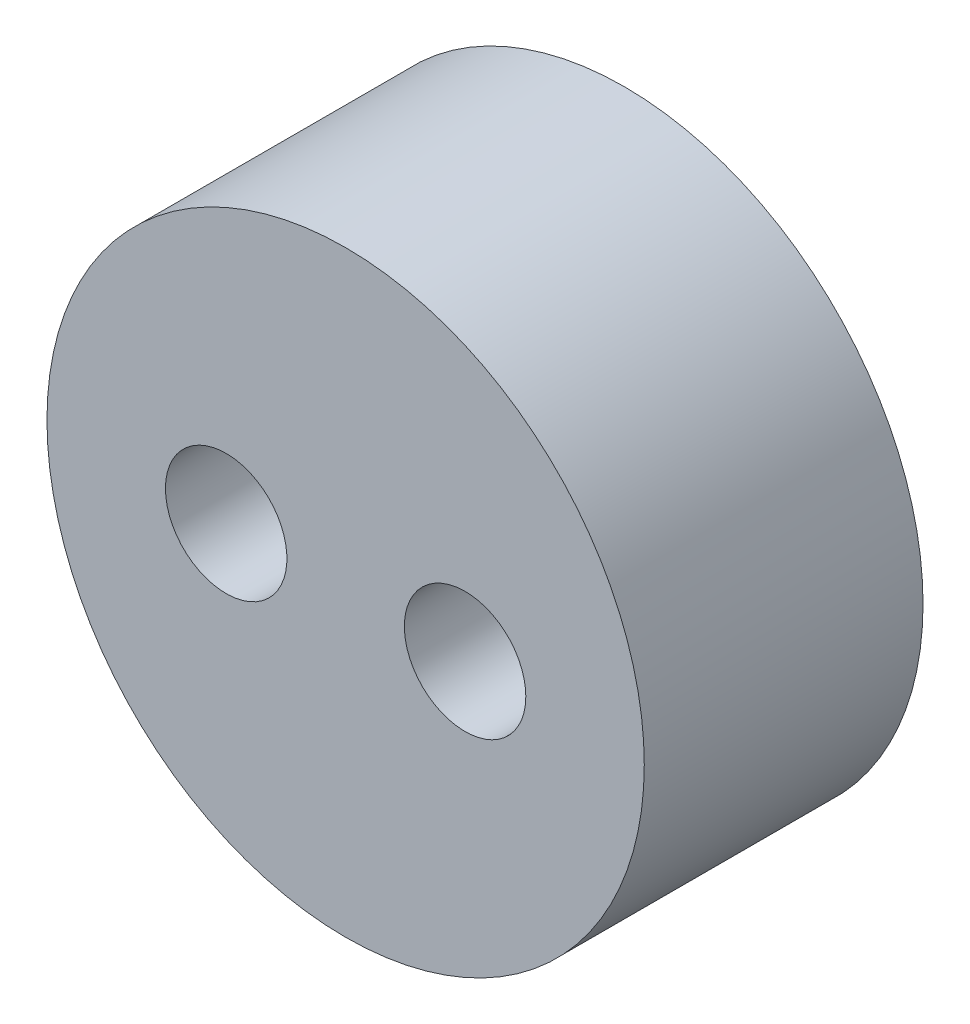
ISO-10303-21;
HEADER;
FILE_DESCRIPTION(('STEP AP214'),'2;1');
FILE_NAME('part.step','',(''),(''),'','','');
FILE_SCHEMA(('AUTOMOTIVE_DESIGN { 1 0 10303 214 1 1 1 1 }'));
ENDSEC;
DATA;
#1=APPLICATION_CONTEXT('core data for automotive mechanical design processes');
#2=APPLICATION_PROTOCOL_DEFINITION('international standard','automotive_design',2000,#1);
#3=PRODUCT_CONTEXT('',#1,'mechanical');
#4=PRODUCT('Part','Part','',(#3));
#5=PRODUCT_RELATED_PRODUCT_CATEGORY('part','',(#4));
#6=PRODUCT_DEFINITION_FORMATION('','',#4);
#7=PRODUCT_DEFINITION_CONTEXT('part definition',#1,'design');
#8=PRODUCT_DEFINITION('design','',#6,#7);
#9=PRODUCT_DEFINITION_SHAPE('','',#8);
#10=(LENGTH_UNIT() NAMED_UNIT(*) SI_UNIT(.MILLI.,.METRE.));
#11=(NAMED_UNIT(*) PLANE_ANGLE_UNIT() SI_UNIT($,.RADIAN.));
#12=(NAMED_UNIT(*) SI_UNIT($,.STERADIAN.) SOLID_ANGLE_UNIT());
#13=UNCERTAINTY_MEASURE_WITH_UNIT(LENGTH_MEASURE(1.E-05),#10,'distance_accuracy_value','');
#14=(GEOMETRIC_REPRESENTATION_CONTEXT(3) GLOBAL_UNCERTAINTY_ASSIGNED_CONTEXT((#13)) GLOBAL_UNIT_ASSIGNED_CONTEXT((#10,
#11,#12)) REPRESENTATION_CONTEXT('',''));
#15=CARTESIAN_POINT('',(0.,0.,0.));
#16=DIRECTION('',(0.,0.,1.));
#17=DIRECTION('',(1.,0.,0.));
#18=AXIS2_PLACEMENT_3D('',#15,#16,#17);
#19=CARTESIAN_POINT('',(0.,0.,7.));
#20=DIRECTION('',(0.,0.,1.));
#21=DIRECTION('',(1.,0.,0.));
#22=AXIS2_PLACEMENT_3D('',#19,#20,#21);
#23=PLANE('',#22);
#24=CARTESIAN_POINT('',(0.,0.,7.));
#25=DIRECTION('',(0.,0.,1.));
#26=DIRECTION('',(1.,0.,0.));
#27=AXIS2_PLACEMENT_3D('',#24,#25,#26);
#28=CIRCLE('',#27,7.5);
#29=CARTESIAN_POINT('',(7.5,0.,7.));
#30=VERTEX_POINT('',#29);
#31=EDGE_CURVE('E10',#30,#30,#28,.T.);
#32=ORIENTED_EDGE('',*,*,#31,.T.);
#33=EDGE_LOOP('',(#32));
#34=FACE_BOUND('',#33,.T.);
#35=CARTESIAN_POINT('',(3.,0.,7.));
#36=DIRECTION('',(0.,0.,1.));
#37=DIRECTION('',(1.,0.,0.));
#38=AXIS2_PLACEMENT_3D('',#35,#36,#37);
#39=CIRCLE('',#38,1.525);
#40=CARTESIAN_POINT('',(4.525,0.,7.));
#41=VERTEX_POINT('',#40);
#42=EDGE_CURVE('E52',#41,#41,#39,.T.);
#43=ORIENTED_EDGE('',*,*,#42,.F.);
#44=EDGE_LOOP('',(#43));
#45=FACE_BOUND('',#44,.T.);
#46=CARTESIAN_POINT('',(-3.,0.,7.));
#47=DIRECTION('',(0.,0.,-1.));
#48=DIRECTION('',(-1.,0.,0.));
#49=AXIS2_PLACEMENT_3D('',#46,#47,#48);
#50=CIRCLE('',#49,1.525);
#51=CARTESIAN_POINT('',(-4.525,0.,7.));
#52=VERTEX_POINT('',#51);
#53=EDGE_CURVE('E55',#52,#52,#50,.T.);
#54=ORIENTED_EDGE('',*,*,#53,.T.);
#55=EDGE_LOOP('',(#54));
#56=FACE_BOUND('',#55,.T.);
#57=ADVANCED_FACE('F36',(#34,#45,#56),#23,.T.);
#58=CARTESIAN_POINT('',(0.,0.,0.));
#59=DIRECTION('',(0.,0.,1.));
#60=DIRECTION('',(1.,0.,0.));
#61=AXIS2_PLACEMENT_3D('',#58,#59,#60);
#62=PLANE('',#61);
#63=CARTESIAN_POINT('',(3.,0.,0.));
#64=DIRECTION('',(0.,0.,1.));
#65=DIRECTION('',(1.,0.,0.));
#66=AXIS2_PLACEMENT_3D('',#63,#64,#65);
#67=CIRCLE('',#66,1.525);
#68=CARTESIAN_POINT('',(4.525,0.,0.));
#69=VERTEX_POINT('',#68);
#70=EDGE_CURVE('E49',#69,#69,#67,.T.);
#71=ORIENTED_EDGE('',*,*,#70,.T.);
#72=EDGE_LOOP('',(#71));
#73=FACE_BOUND('',#72,.T.);
#74=CARTESIAN_POINT('',(0.,0.,0.));
#75=DIRECTION('',(0.,0.,1.));
#76=DIRECTION('',(1.,0.,0.));
#77=AXIS2_PLACEMENT_3D('',#74,#75,#76);
#78=CIRCLE('',#77,7.5);
#79=CARTESIAN_POINT('',(7.5,0.,0.));
#80=VERTEX_POINT('',#79);
#81=EDGE_CURVE('E40',#80,#80,#78,.T.);
#82=ORIENTED_EDGE('',*,*,#81,.F.);
#83=EDGE_LOOP('',(#82));
#84=FACE_BOUND('',#83,.T.);
#85=CARTESIAN_POINT('',(-3.,0.,0.));
#86=DIRECTION('',(0.,0.,-1.));
#87=DIRECTION('',(-1.,0.,0.));
#88=AXIS2_PLACEMENT_3D('',#85,#86,#87);
#89=CIRCLE('',#88,1.525);
#90=CARTESIAN_POINT('',(-4.525,0.,0.));
#91=VERTEX_POINT('',#90);
#92=EDGE_CURVE('E47',#91,#91,#89,.T.);
#93=ORIENTED_EDGE('',*,*,#92,.F.);
#94=EDGE_LOOP('',(#93));
#95=FACE_BOUND('',#94,.T.);
#96=ADVANCED_FACE('F64',(#73,#84,#95),#62,.F.);
#97=CARTESIAN_POINT('',(0.,0.,7.));
#98=DIRECTION('',(0.,0.,-1.));
#99=DIRECTION('',(-1.,0.,0.));
#100=AXIS2_PLACEMENT_3D('',#97,#98,#99);
#101=CYLINDRICAL_SURFACE('',#100,7.5);
#102=ORIENTED_EDGE('',*,*,#31,.F.);
#103=EDGE_LOOP('',(#102));
#104=FACE_BOUND('',#103,.T.);
#105=ORIENTED_EDGE('',*,*,#81,.T.);
#106=EDGE_LOOP('',(#105));
#107=FACE_BOUND('',#106,.T.);
#108=ADVANCED_FACE('F38',(#104,#107),#101,.T.);
#109=CARTESIAN_POINT('',(3.,0.,0.));
#110=DIRECTION('',(0.,0.,1.));
#111=DIRECTION('',(1.,0.,0.));
#112=AXIS2_PLACEMENT_3D('',#109,#110,#111);
#113=CYLINDRICAL_SURFACE('',#112,1.525);
#114=ORIENTED_EDGE('',*,*,#70,.F.);
#115=EDGE_LOOP('',(#114));
#116=FACE_BOUND('',#115,.T.);
#117=ORIENTED_EDGE('',*,*,#42,.T.);
#118=EDGE_LOOP('',(#117));
#119=FACE_BOUND('',#118,.T.);
#120=ADVANCED_FACE('F71',(#116,#119),#113,.F.);
#121=CARTESIAN_POINT('',(-3.,0.,0.));
#122=DIRECTION('',(0.,0.,1.));
#123=DIRECTION('',(1.,0.,0.));
#124=AXIS2_PLACEMENT_3D('',#121,#122,#123);
#125=CYLINDRICAL_SURFACE('',#124,1.525);
#126=ORIENTED_EDGE('',*,*,#92,.T.);
#127=EDGE_LOOP('',(#126));
#128=FACE_BOUND('',#127,.T.);
#129=ORIENTED_EDGE('',*,*,#53,.F.);
#130=EDGE_LOOP('',(#129));
#131=FACE_BOUND('',#130,.T.);
#132=ADVANCED_FACE('F61',(#128,#131),#125,.F.);
#133=CLOSED_SHELL('',(#57,#96,#108,#120,#132));
#134=MANIFOLD_SOLID_BREP('B2',#133);
#135=ADVANCED_BREP_SHAPE_REPRESENTATION('',(#18,#134),#14);
#136=SHAPE_DEFINITION_REPRESENTATION(#9,#135);
ENDSEC;
END-ISO-10303-21;
